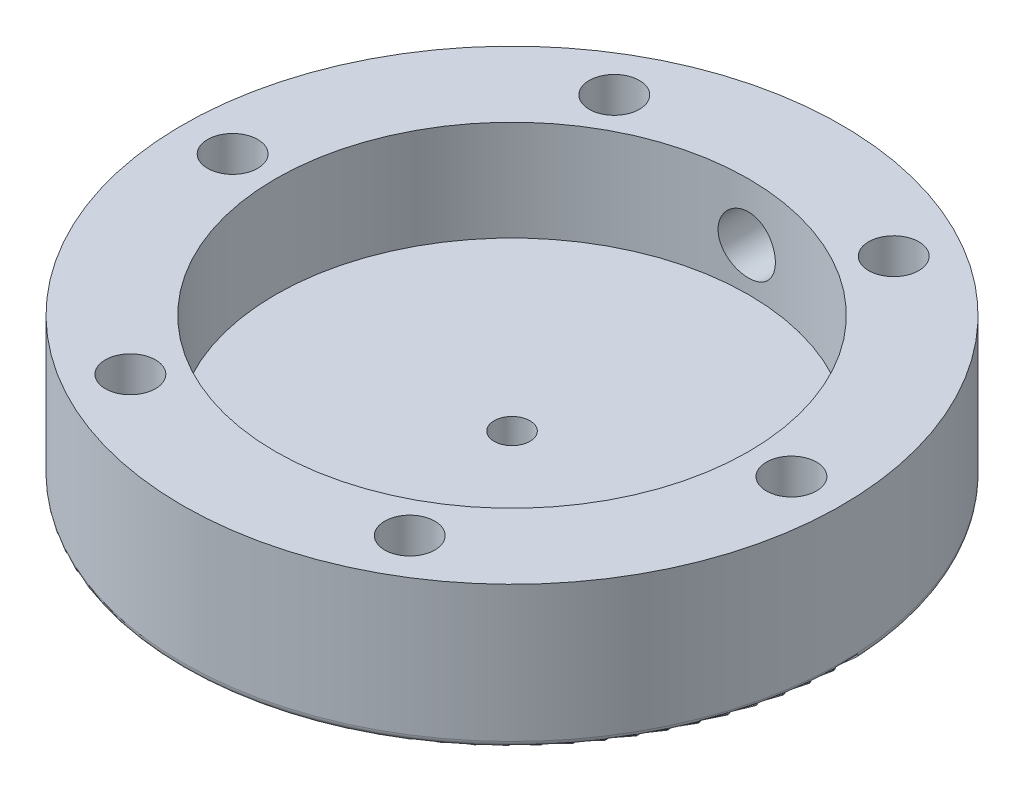
ISO-10303-21;
HEADER;
FILE_DESCRIPTION(('STEP AP214'),'2;1');
FILE_NAME('part.step','',(''),(''),'','','');
FILE_SCHEMA(('AUTOMOTIVE_DESIGN { 1 0 10303 214 1 1 1 1 }'));
ENDSEC;
DATA;
#1=APPLICATION_CONTEXT('core data for automotive mechanical design processes');
#2=APPLICATION_PROTOCOL_DEFINITION('international standard','automotive_design',2000,#1);
#3=PRODUCT_CONTEXT('',#1,'mechanical');
#4=PRODUCT('Part','Part','',(#3));
#5=PRODUCT_RELATED_PRODUCT_CATEGORY('part','',(#4));
#6=PRODUCT_DEFINITION_FORMATION('','',#4);
#7=PRODUCT_DEFINITION_CONTEXT('part definition',#1,'design');
#8=PRODUCT_DEFINITION('design','',#6,#7);
#9=PRODUCT_DEFINITION_SHAPE('','',#8);
#10=(LENGTH_UNIT() NAMED_UNIT(*) SI_UNIT(.MILLI.,.METRE.));
#11=(NAMED_UNIT(*) PLANE_ANGLE_UNIT() SI_UNIT($,.RADIAN.));
#12=(NAMED_UNIT(*) SI_UNIT($,.STERADIAN.) SOLID_ANGLE_UNIT());
#13=UNCERTAINTY_MEASURE_WITH_UNIT(LENGTH_MEASURE(1.E-05),#10,'distance_accuracy_value','');
#14=(GEOMETRIC_REPRESENTATION_CONTEXT(3) GLOBAL_UNCERTAINTY_ASSIGNED_CONTEXT((#13)) GLOBAL_UNIT_ASSIGNED_CONTEXT((#10,
#11,#12)) REPRESENTATION_CONTEXT('',''));
#15=CARTESIAN_POINT('',(0.,0.,0.));
#16=DIRECTION('',(0.,0.,1.));
#17=DIRECTION('',(1.,0.,0.));
#18=AXIS2_PLACEMENT_3D('',#15,#16,#17);
#19=CARTESIAN_POINT('',(0.,20.,0.));
#20=DIRECTION('',(0.,-1.,0.));
#21=DIRECTION('',(0.,0.,-1.));
#22=AXIS2_PLACEMENT_3D('',#19,#20,#21);
#23=CYLINDRICAL_SURFACE('',#22,2.5);
#24=CARTESIAN_POINT('',(0.,6.,0.));
#25=DIRECTION('',(0.,1.,0.));
#26=DIRECTION('',(0.,0.,1.));
#27=AXIS2_PLACEMENT_3D('',#24,#25,#26);
#28=CIRCLE('',#27,2.5);
#29=CARTESIAN_POINT('',(0.,6.,2.5));
#30=VERTEX_POINT('',#29);
#31=EDGE_CURVE('E65',#30,#30,#28,.T.);
#32=ORIENTED_EDGE('',*,*,#31,.T.);
#33=EDGE_LOOP('',(#32));
#34=FACE_BOUND('',#33,.T.);
#35=CARTESIAN_POINT('',(0.,0.,0.));
#36=DIRECTION('',(0.,-1.,0.));
#37=DIRECTION('',(0.,0.,-1.));
#38=AXIS2_PLACEMENT_3D('',#35,#36,#37);
#39=CIRCLE('',#38,2.5);
#40=CARTESIAN_POINT('',(0.,0.,-2.5));
#41=VERTEX_POINT('',#40);
#42=EDGE_CURVE('E54',#41,#41,#39,.F.);
#43=ORIENTED_EDGE('',*,*,#42,.F.);
#44=EDGE_LOOP('',(#43));
#45=FACE_BOUND('',#44,.T.);
#46=ADVANCED_FACE('F33',(#34,#45),#23,.F.);
#47=CARTESIAN_POINT('',(0.,20.,0.));
#48=DIRECTION('',(0.,-1.,0.));
#49=DIRECTION('',(0.,0.,-1.));
#50=AXIS2_PLACEMENT_3D('',#47,#48,#49);
#51=CYLINDRICAL_SURFACE('',#50,46.);
#52=CARTESIAN_POINT('',(0.,16.,-46.));
#53=CARTESIAN_POINT('',(-0.224227383894109,15.9999902223244,-45.9999977285705));
#54=CARTESIAN_POINT('',(-0.448606525183141,15.9810823481538,-45.9983430362557));
#55=CARTESIAN_POINT('',(-0.891154156323271,15.905934927026,-45.9919012379841));
#56=CARTESIAN_POINT('',(-1.10931535995352,15.8496533211501,-45.9871106030481));
#57=CARTESIAN_POINT('',(-1.53295378380859,15.7014005001201,-45.9749381658736));
#58=CARTESIAN_POINT('',(-1.73843820070689,15.6094497546826,-45.9675578500262));
#59=CARTESIAN_POINT('',(-2.13100809888229,15.3925060672846,-45.9510332255131));
#60=CARTESIAN_POINT('',(-2.31809744825638,15.2675200924152,-45.9418892889027));
#61=CARTESIAN_POINT('',(-2.66913129878992,14.9876817198155,-45.9228348976703));
#62=CARTESIAN_POINT('',(-2.83301797480505,14.832756902906,-45.9129226200477));
#63=CARTESIAN_POINT('',(-3.13249799915954,14.4975919754114,-45.8934639727461));
#64=CARTESIAN_POINT('',(-3.26809009164363,14.3173507417508,-45.883917619324));
#65=CARTESIAN_POINT('',(-3.50732983244712,13.9363164964854,-45.8662523263715));
#66=CARTESIAN_POINT('',(-3.61092631199781,13.7354912420483,-45.8581356821084));
#67=CARTESIAN_POINT('',(-3.78290727978104,13.3192141148022,-45.8442700926442));
#68=CARTESIAN_POINT('',(-3.85129243978993,13.1037625211294,-45.8385211022726));
#69=CARTESIAN_POINT('',(-3.95074097738121,12.6649304672214,-45.830057344427));
#70=CARTESIAN_POINT('',(-3.98189897039565,12.4415715996064,-45.8273348860433));
#71=CARTESIAN_POINT('',(-4.00630104440279,11.9927790924027,-45.8252082353394));
#72=CARTESIAN_POINT('',(-3.99954589438519,11.7673454949882,-45.8258039757165));
#73=CARTESIAN_POINT('',(-3.9483915880778,11.321451925075,-45.8302394140666));
#74=CARTESIAN_POINT('',(-3.90409535607296,11.1009800442069,-45.8340702424775));
#75=CARTESIAN_POINT('',(-3.77927624600677,10.6706122676921,-45.8445303189289));
#76=CARTESIAN_POINT('',(-3.69875298659972,10.460716483401,-45.8511595964273));
#77=CARTESIAN_POINT('',(-3.50365067255338,10.0571316495117,-45.866479827065));
#78=CARTESIAN_POINT('',(-3.38902554426596,9.86346498303699,-45.8751735661868));
#79=CARTESIAN_POINT('',(-3.12900647092458,9.49808067860247,-45.8936406284605));
#80=CARTESIAN_POINT('',(-2.98361184659911,9.3263635253373,-45.9034139754438));
#81=CARTESIAN_POINT('',(-2.66560421524801,9.00915428882337,-45.9229785147518));
#82=CARTESIAN_POINT('',(-2.4929022472207,8.86375137254269,-45.9327696582409));
#83=CARTESIAN_POINT('',(-2.12549237013378,8.60398782752038,-45.95123564835));
#84=CARTESIAN_POINT('',(-1.93078444459427,8.48962722202606,-45.959910494134));
#85=CARTESIAN_POINT('',(-1.52483096588586,8.29519972840698,-45.9751683502548));
#86=CARTESIAN_POINT('',(-1.31358345578605,8.21513690560241,-45.9817511125928));
#87=CARTESIAN_POINT('',(-0.880574461427622,8.09164068539059,-45.9920803344126));
#88=CARTESIAN_POINT('',(-0.658813214898611,8.04820646017873,-45.995826857993));
#89=CARTESIAN_POINT('',(-0.21184447915289,7.99931243567538,-46.0000532442106));
#90=CARTESIAN_POINT('',(0.0133494440173136,7.99372949782599,-46.0005436994455));
#91=CARTESIAN_POINT('',(0.461469996673726,8.02037377739986,-45.9982310016282));
#92=CARTESIAN_POINT('',(0.684396649193822,8.05260061031447,-45.9954278820702));
#93=CARTESIAN_POINT('',(1.12130261089924,8.15384754873136,-45.9868500316988));
#94=CARTESIAN_POINT('',(1.33529527230571,8.22281046045096,-45.9810799206281));
#95=CARTESIAN_POINT('',(1.74867267660003,8.39551346360269,-45.967216103292));
#96=CARTESIAN_POINT('',(1.9480571686755,8.49925415197528,-45.9591223571432));
#97=CARTESIAN_POINT('',(2.32711808841676,8.73887651706901,-45.9414917704405));
#98=CARTESIAN_POINT('',(2.50674286157891,8.87483963498195,-45.9319512956969));
#99=CARTESIAN_POINT('',(2.84066374135941,9.17492989696734,-45.9125109361372));
#100=CARTESIAN_POINT('',(2.99495936860324,9.33905757395658,-45.9026110445232));
#101=CARTESIAN_POINT('',(3.27426550151283,9.69135291706406,-45.8835361672919));
#102=CARTESIAN_POINT('',(3.39919555788599,9.87958449040562,-45.8743632176725));
#103=CARTESIAN_POINT('',(3.61567234236894,10.2744269056061,-45.8578101371487));
#104=CARTESIAN_POINT('',(3.70721942907557,10.4810375500091,-45.8504299869865));
#105=CARTESIAN_POINT('',(3.85419502490978,10.9064901436496,-45.8383098416306));
#106=CARTESIAN_POINT('',(3.90967250193944,11.1253150704724,-45.8335662683104));
#107=CARTESIAN_POINT('',(3.98309339935581,11.5692170335405,-45.8272445862578));
#108=CARTESIAN_POINT('',(4.00103761191455,11.7942939377307,-45.825666410717));
#109=CARTESIAN_POINT('',(3.99887309501891,12.2435112367157,-45.8258552825946));
#110=CARTESIAN_POINT('',(3.97889076180226,12.4676522560246,-45.8276112185648));
#111=CARTESIAN_POINT('',(3.90170423350695,12.9093817014037,-45.834246839158));
#112=CARTESIAN_POINT('',(3.84449998433456,13.1269701179508,-45.8391265283207));
#113=CARTESIAN_POINT('',(3.69452606310881,13.5494241459757,-45.8514568827458));
#114=CARTESIAN_POINT('',(3.6017589707124,13.7542906790211,-45.8589073615243));
#115=CARTESIAN_POINT('',(3.38330655214035,14.1455631184226,-45.8755401471554));
#116=CARTESIAN_POINT('',(3.25762167508082,14.3319692765964,-45.8847224303796));
#117=CARTESIAN_POINT('',(2.97642627183586,14.6816767736096,-45.9038206784499));
#118=CARTESIAN_POINT('',(2.82082198308656,14.8449025967924,-45.9137388879215));
#119=CARTESIAN_POINT('',(2.48437904881077,15.1429886856669,-45.93317092391));
#120=CARTESIAN_POINT('',(2.303534319391,15.2778420928329,-45.9426846522082));
#121=CARTESIAN_POINT('',(1.92136583977714,15.5155531499808,-45.9602544666636));
#122=CARTESIAN_POINT('',(1.72000201971635,15.6183465404037,-45.9683076119567));
#123=CARTESIAN_POINT('',(1.30293824908928,15.7885308261092,-45.9820150223571));
#124=CARTESIAN_POINT('',(1.08725503492918,15.8559622592335,-45.9876720328809));
#125=CARTESIAN_POINT('',(0.725257992711599,15.9364074005984,-45.994503746574));
#126=CARTESIAN_POINT('',(0.581269530602112,15.9602227509663,-45.9965554127388));
#127=CARTESIAN_POINT('',(0.291542097632153,15.9920222063787,-45.9993042759584));
#128=CARTESIAN_POINT('',(0.145803131912244,16.000006357902,-46.0000014769897));
#129=CARTESIAN_POINT('',(0.,16.,-46.));
#130=B_SPLINE_CURVE_WITH_KNOTS('',3,(#52,#53,#54,#55,#56,#57,#58,#59,#60,#61,#62,#63,#64,#65,
#66,#67,#68,#69,#70,#71,#72,#73,#74,#75,#76,#77,#78,#79,#80,#81,#82,#83,#84,#85,#86,#87,#88,#89,
#90,#91,#92,#93,#94,#95,#96,#97,#98,#99,#100,#101,#102,#103,#104,#105,#106,#107,#108,#109,#110,
#111,#112,#113,#114,#115,#116,#117,#118,#119,#120,#121,#122,#123,#124,#125,#126,#127,#128,#129),
.UNSPECIFIED.,.T.,.F.,(4,2,2,2,2,2,2,2,2,2,2,2,2,2,2,2,2,2,2,2,2,2,2,2,2,2,2,2,2,2,2,2,2,2,2,2,
2,2,4),(0.,0.672149795371173,1.34505728632151,2.01757918073403,2.68995935408334,
3.36398678235651,4.03804412098098,4.71317392514569,5.38829084842311,6.06168824011353,
6.73507197338011,7.40661547829384,8.07816605241074,8.75062808366532,9.42310496183092,
10.0978195498406,10.7725346431367,11.4473296883784,12.1221094828746,12.7946930125715,
13.4672697024505,14.1388023163357,14.8103464572807,15.4836063550193,16.1568789932759,
16.8319751599037,17.507064074496,18.1812345677475,18.855390831904,19.5273043074988,
20.1992187595716,20.8710844815444,21.5429410373477,22.2169384480893,22.8910985989687,
23.5666014469276,24.2413282173606,24.6783927333046,25.11545596607),.UNSPECIFIED.);
#131=CARTESIAN_POINT('',(0.,16.,-46.));
#132=VERTEX_POINT('',#131);
#133=EDGE_CURVE('E119',#132,#132,#130,.T.);
#134=ORIENTED_EDGE('',*,*,#133,.T.);
#135=EDGE_LOOP('',(#134));
#136=FACE_BOUND('',#135,.T.);
#137=CARTESIAN_POINT('',(0.,1.,0.));
#138=DIRECTION('',(0.,1.,0.));
#139=DIRECTION('',(0.,0.,1.));
#140=AXIS2_PLACEMENT_3D('',#137,#138,#139);
#141=CIRCLE('',#140,46.);
#142=CARTESIAN_POINT('',(0.,1.,46.));
#143=VERTEX_POINT('',#142);
#144=EDGE_CURVE('E61',#143,#143,#141,.T.);
#145=ORIENTED_EDGE('',*,*,#144,.T.);
#146=EDGE_LOOP('',(#145));
#147=FACE_BOUND('',#146,.T.);
#148=CARTESIAN_POINT('',(0.,20.,0.));
#149=DIRECTION('',(0.,1.,0.));
#150=DIRECTION('',(0.,0.,1.));
#151=AXIS2_PLACEMENT_3D('',#148,#149,#150);
#152=CIRCLE('',#151,46.);
#153=CARTESIAN_POINT('',(0.,20.,46.));
#154=VERTEX_POINT('',#153);
#155=EDGE_CURVE('E70',#154,#154,#152,.T.);
#156=ORIENTED_EDGE('',*,*,#155,.F.);
#157=EDGE_LOOP('',(#156));
#158=FACE_BOUND('',#157,.T.);
#159=ADVANCED_FACE('F125',(#136,#147,#158),#51,.T.);
#160=CARTESIAN_POINT('',(0.,20.,0.));
#161=DIRECTION('',(0.,1.,0.));
#162=DIRECTION('',(0.,0.,1.));
#163=AXIS2_PLACEMENT_3D('',#160,#161,#162);
#164=PLANE('',#163);
#165=CARTESIAN_POINT('',(-39.,20.,0.));
#166=DIRECTION('',(0.,-1.,0.));
#167=DIRECTION('',(0.,0.,-1.));
#168=AXIS2_PLACEMENT_3D('',#165,#166,#167);
#169=CIRCLE('',#168,3.5);
#170=CARTESIAN_POINT('',(-39.,20.,-3.5));
#171=VERTEX_POINT('',#170);
#172=EDGE_CURVE('E69',#171,#171,#169,.T.);
#173=ORIENTED_EDGE('',*,*,#172,.T.);
#174=EDGE_LOOP('',(#173));
#175=FACE_BOUND('',#174,.T.);
#176=CARTESIAN_POINT('',(-19.5000000000004,20.,-33.7749907475929));
#177=DIRECTION('',(0.,-1.,0.));
#178=DIRECTION('',(0.,0.,-1.));
#179=AXIS2_PLACEMENT_3D('',#176,#177,#178);
#180=CIRCLE('',#179,3.5);
#181=CARTESIAN_POINT('',(-19.5000000000004,20.,-37.2749907475929));
#182=VERTEX_POINT('',#181);
#183=EDGE_CURVE('E87',#182,#182,#180,.T.);
#184=ORIENTED_EDGE('',*,*,#183,.T.);
#185=EDGE_LOOP('',(#184));
#186=FACE_BOUND('',#185,.T.);
#187=CARTESIAN_POINT('',(19.4999999999997,20.,-33.7749907475933));
#188=DIRECTION('',(0.,-1.,0.));
#189=DIRECTION('',(0.,0.,-1.));
#190=AXIS2_PLACEMENT_3D('',#187,#188,#189);
#191=CIRCLE('',#190,3.5);
#192=CARTESIAN_POINT('',(19.4999999999997,20.,-37.2749907475933));
#193=VERTEX_POINT('',#192);
#194=EDGE_CURVE('E86',#193,#193,#191,.T.);
#195=ORIENTED_EDGE('',*,*,#194,.T.);
#196=EDGE_LOOP('',(#195));
#197=FACE_BOUND('',#196,.T.);
#198=CARTESIAN_POINT('',(39.,20.,-2.72335544429764E-13));
#199=DIRECTION('',(0.,-1.,0.));
#200=DIRECTION('',(0.,0.,-1.));
#201=AXIS2_PLACEMENT_3D('',#198,#199,#200);
#202=CIRCLE('',#201,3.5);
#203=CARTESIAN_POINT('',(39.,20.,-3.50000000000027));
#204=VERTEX_POINT('',#203);
#205=EDGE_CURVE('E93',#204,#204,#202,.T.);
#206=ORIENTED_EDGE('',*,*,#205,.T.);
#207=EDGE_LOOP('',(#206));
#208=FACE_BOUND('',#207,.T.);
#209=CARTESIAN_POINT('',(19.5000000000002,20.,33.774990747593));
#210=DIRECTION('',(0.,-1.,0.));
#211=DIRECTION('',(0.,0.,-1.));
#212=AXIS2_PLACEMENT_3D('',#209,#210,#211);
#213=CIRCLE('',#212,3.5);
#214=CARTESIAN_POINT('',(19.5000000000002,20.,30.274990747593));
#215=VERTEX_POINT('',#214);
#216=EDGE_CURVE('E99',#215,#215,#213,.T.);
#217=ORIENTED_EDGE('',*,*,#216,.T.);
#218=EDGE_LOOP('',(#217));
#219=FACE_BOUND('',#218,.T.);
#220=CARTESIAN_POINT('',(-19.4999999999999,20.,33.7749907475932));
#221=DIRECTION('',(0.,-1.,0.));
#222=DIRECTION('',(0.,0.,-1.));
#223=AXIS2_PLACEMENT_3D('',#220,#221,#222);
#224=CIRCLE('',#223,3.5);
#225=CARTESIAN_POINT('',(-19.4999999999999,20.,30.2749907475932));
#226=VERTEX_POINT('',#225);
#227=EDGE_CURVE('E105',#226,#226,#224,.T.);
#228=ORIENTED_EDGE('',*,*,#227,.T.);
#229=EDGE_LOOP('',(#228));
#230=FACE_BOUND('',#229,.T.);
#231=CARTESIAN_POINT('',(0.,20.,0.));
#232=DIRECTION('',(0.,1.,0.));
#233=DIRECTION('',(0.,0.,1.));
#234=AXIS2_PLACEMENT_3D('',#231,#232,#233);
#235=CIRCLE('',#234,33.);
#236=CARTESIAN_POINT('',(0.,20.,33.));
#237=VERTEX_POINT('',#236);
#238=EDGE_CURVE('E68',#237,#237,#235,.T.);
#239=ORIENTED_EDGE('',*,*,#238,.F.);
#240=EDGE_LOOP('',(#239));
#241=FACE_BOUND('',#240,.T.);
#242=ORIENTED_EDGE('',*,*,#155,.T.);
#243=EDGE_LOOP('',(#242));
#244=FACE_BOUND('',#243,.T.);
#245=ADVANCED_FACE('F186',(#175,#186,#197,#208,#219,#230,#241,#244),#164,.T.);
#246=CARTESIAN_POINT('',(0.,0.,0.));
#247=DIRECTION('',(0.,1.,0.));
#248=DIRECTION('',(0.,0.,1.));
#249=AXIS2_PLACEMENT_3D('',#246,#247,#248);
#250=PLANE('',#249);
#251=CARTESIAN_POINT('',(0.,0.,0.));
#252=DIRECTION('',(0.,1.,0.));
#253=DIRECTION('',(0.,0.,1.));
#254=AXIS2_PLACEMENT_3D('',#251,#252,#253);
#255=CIRCLE('',#254,45.);
#256=CARTESIAN_POINT('',(0.,0.,45.));
#257=VERTEX_POINT('',#256);
#258=EDGE_CURVE('E51',#257,#257,#255,.F.);
#259=ORIENTED_EDGE('',*,*,#258,.T.);
#260=EDGE_LOOP('',(#259));
#261=FACE_BOUND('',#260,.T.);
#262=CARTESIAN_POINT('',(-39.,0.,0.));
#263=DIRECTION('',(0.,-1.,0.));
#264=DIRECTION('',(0.,0.,-1.));
#265=AXIS2_PLACEMENT_3D('',#262,#263,#264);
#266=CIRCLE('',#265,3.5);
#267=CARTESIAN_POINT('',(-39.,0.,-3.5));
#268=VERTEX_POINT('',#267);
#269=EDGE_CURVE('E108',#268,#268,#266,.T.);
#270=ORIENTED_EDGE('',*,*,#269,.F.);
#271=EDGE_LOOP('',(#270));
#272=FACE_BOUND('',#271,.T.);
#273=CARTESIAN_POINT('',(-19.5000000000004,0.,-33.7749907475929));
#274=DIRECTION('',(0.,-1.,0.));
#275=DIRECTION('',(0.,0.,-1.));
#276=AXIS2_PLACEMENT_3D('',#273,#274,#275);
#277=CIRCLE('',#276,3.5);
#278=CARTESIAN_POINT('',(-19.5000000000004,0.,-37.2749907475929));
#279=VERTEX_POINT('',#278);
#280=EDGE_CURVE('E57',#279,#279,#277,.T.);
#281=ORIENTED_EDGE('',*,*,#280,.F.);
#282=EDGE_LOOP('',(#281));
#283=FACE_BOUND('',#282,.T.);
#284=CARTESIAN_POINT('',(19.4999999999997,0.,-33.7749907475933));
#285=DIRECTION('',(0.,-1.,0.));
#286=DIRECTION('',(0.,0.,-1.));
#287=AXIS2_PLACEMENT_3D('',#284,#285,#286);
#288=CIRCLE('',#287,3.5);
#289=CARTESIAN_POINT('',(19.4999999999997,0.,-37.2749907475933));
#290=VERTEX_POINT('',#289);
#291=EDGE_CURVE('E83',#290,#290,#288,.T.);
#292=ORIENTED_EDGE('',*,*,#291,.F.);
#293=EDGE_LOOP('',(#292));
#294=FACE_BOUND('',#293,.T.);
#295=CARTESIAN_POINT('',(39.,0.,-2.72335544429764E-13));
#296=DIRECTION('',(0.,-1.,0.));
#297=DIRECTION('',(0.,0.,-1.));
#298=AXIS2_PLACEMENT_3D('',#295,#296,#297);
#299=CIRCLE('',#298,3.5);
#300=CARTESIAN_POINT('',(39.,0.,-3.50000000000027));
#301=VERTEX_POINT('',#300);
#302=EDGE_CURVE('E90',#301,#301,#299,.T.);
#303=ORIENTED_EDGE('',*,*,#302,.F.);
#304=EDGE_LOOP('',(#303));
#305=FACE_BOUND('',#304,.T.);
#306=CARTESIAN_POINT('',(19.5000000000002,0.,33.774990747593));
#307=DIRECTION('',(0.,-1.,0.));
#308=DIRECTION('',(0.,0.,-1.));
#309=AXIS2_PLACEMENT_3D('',#306,#307,#308);
#310=CIRCLE('',#309,3.5);
#311=CARTESIAN_POINT('',(19.5000000000002,0.,30.274990747593));
#312=VERTEX_POINT('',#311);
#313=EDGE_CURVE('E96',#312,#312,#310,.T.);
#314=ORIENTED_EDGE('',*,*,#313,.F.);
#315=EDGE_LOOP('',(#314));
#316=FACE_BOUND('',#315,.T.);
#317=CARTESIAN_POINT('',(-19.4999999999999,0.,33.7749907475932));
#318=DIRECTION('',(0.,-1.,0.));
#319=DIRECTION('',(0.,0.,-1.));
#320=AXIS2_PLACEMENT_3D('',#317,#318,#319);
#321=CIRCLE('',#320,3.5);
#322=CARTESIAN_POINT('',(-19.4999999999999,0.,30.2749907475932));
#323=VERTEX_POINT('',#322);
#324=EDGE_CURVE('E102',#323,#323,#321,.T.);
#325=ORIENTED_EDGE('',*,*,#324,.F.);
#326=EDGE_LOOP('',(#325));
#327=FACE_BOUND('',#326,.T.);
#328=CARTESIAN_POINT('',(0.,0.,0.));
#329=DIRECTION('',(0.,-1.,0.));
#330=DIRECTION('',(0.,0.,-1.));
#331=AXIS2_PLACEMENT_3D('',#328,#329,#330);
#332=CIRCLE('',#331,12.);
#333=CARTESIAN_POINT('',(0.,0.,-12.));
#334=VERTEX_POINT('',#333);
#335=EDGE_CURVE('E64',#334,#334,#332,.T.);
#336=ORIENTED_EDGE('',*,*,#335,.F.);
#337=EDGE_LOOP('',(#336));
#338=FACE_BOUND('',#337,.T.);
#339=ADVANCED_FACE('F184',(#261,#272,#283,#294,#305,#316,#327,#338),#250,.F.);
#340=CARTESIAN_POINT('',(0.,-10.,0.));
#341=DIRECTION('',(0.,1.,0.));
#342=DIRECTION('',(0.,0.,1.));
#343=AXIS2_PLACEMENT_3D('',#340,#341,#342);
#344=CYLINDRICAL_SURFACE('',#343,12.);
#345=CARTESIAN_POINT('',(0.,-10.,0.));
#346=DIRECTION('',(0.,-1.,0.));
#347=DIRECTION('',(0.,0.,-1.));
#348=AXIS2_PLACEMENT_3D('',#345,#346,#347);
#349=CIRCLE('',#348,12.);
#350=CARTESIAN_POINT('',(0.,-10.,-12.));
#351=VERTEX_POINT('',#350);
#352=EDGE_CURVE('E73',#351,#351,#349,.T.);
#353=ORIENTED_EDGE('',*,*,#352,.F.);
#354=EDGE_LOOP('',(#353));
#355=FACE_BOUND('',#354,.T.);
#356=ORIENTED_EDGE('',*,*,#335,.T.);
#357=EDGE_LOOP('',(#356));
#358=FACE_BOUND('',#357,.T.);
#359=ADVANCED_FACE('F181',(#355,#358),#344,.T.);
#360=CARTESIAN_POINT('',(0.,-10.,0.));
#361=DIRECTION('',(0.,-1.,0.));
#362=DIRECTION('',(0.,0.,-1.));
#363=AXIS2_PLACEMENT_3D('',#360,#361,#362);
#364=PLANE('',#363);
#365=CARTESIAN_POINT('',(0.,-10.,0.));
#366=DIRECTION('',(0.,-1.,0.));
#367=DIRECTION('',(0.,0.,-1.));
#368=AXIS2_PLACEMENT_3D('',#365,#366,#367);
#369=CIRCLE('',#368,7.99999999999999);
#370=CARTESIAN_POINT('',(0.,-10.,-7.99999999999999));
#371=VERTEX_POINT('',#370);
#372=EDGE_CURVE('E10',#371,#371,#369,.F.);
#373=ORIENTED_EDGE('',*,*,#372,.T.);
#374=EDGE_LOOP('',(#373));
#375=FACE_BOUND('',#374,.T.);
#376=ORIENTED_EDGE('',*,*,#352,.T.);
#377=EDGE_LOOP('',(#376));
#378=FACE_BOUND('',#377,.T.);
#379=ADVANCED_FACE('F177',(#375,#378),#364,.T.);
#380=CARTESIAN_POINT('',(0.,6.,0.));
#381=DIRECTION('',(0.,1.,0.));
#382=DIRECTION('',(0.,0.,1.));
#383=AXIS2_PLACEMENT_3D('',#380,#381,#382);
#384=CYLINDRICAL_SURFACE('',#383,33.);
#385=CARTESIAN_POINT('',(4.,12.,-32.7566787083184));
#386=CARTESIAN_POINT('',(3.99999045298508,11.7762055034807,-32.7566818366577));
#387=CARTESIAN_POINT('',(3.98115515343243,11.5522697896419,-32.7589969177124));
#388=CARTESIAN_POINT('',(3.90631302023377,11.110626634477,-32.7680039727008));
#389=CARTESIAN_POINT('',(3.85026699225597,10.8929260131031,-32.7747005616006));
#390=CARTESIAN_POINT('',(3.70267655289125,10.4702114858093,-32.7917012296198));
#391=CARTESIAN_POINT('',(3.61115580778966,10.2651892272727,-32.8020029032309));
#392=CARTESIAN_POINT('',(3.39526371924446,9.87345279800498,-32.8250500965597));
#393=CARTESIAN_POINT('',(3.27089814151645,9.68673542184091,-32.8377951872424));
#394=CARTESIAN_POINT('',(2.99214417405283,9.33588554601347,-32.864368406131));
#395=CARTESIAN_POINT('',(2.83761726919589,9.17186345073592,-32.8782013482531));
#396=CARTESIAN_POINT('',(2.50322501027308,8.87201333478101,-32.905348295857));
#397=CARTESIAN_POINT('',(2.32335841356232,8.73618669760225,-32.9186622758482));
#398=CARTESIAN_POINT('',(1.94270104483964,8.49618911358668,-32.9433202079721));
#399=CARTESIAN_POINT('',(1.74184703190994,8.39211777612165,-32.9546579142429));
#400=CARTESIAN_POINT('',(1.325352481192,8.21922286326735,-32.9740330113373));
#401=CARTESIAN_POINT('',(1.10971246115218,8.15039805439581,-32.9820705176523));
#402=CARTESIAN_POINT('',(0.670894532630863,8.05027889992132,-32.993905717215));
#403=CARTESIAN_POINT('',(0.447759006205902,8.0188012813973,-32.9977241084167));
#404=CARTESIAN_POINT('',(-0.00065790244033778,7.99370220196666,-33.0007614848467));
#405=CARTESIAN_POINT('',(-0.22593920469066,8.00007933571949,-32.9999806408196));
#406=CARTESIAN_POINT('',(-0.671006287963217,8.05036154861505,-32.9939243045577));
#407=CARTESIAN_POINT('',(-0.890814702972183,8.09406952855121,-32.9886724189773));
#408=CARTESIAN_POINT('',(-1.31995337515371,8.2174647919492,-32.974290708158));
#409=CARTESIAN_POINT('',(-1.52928344316775,8.2971527246728,-32.9651608129403));
#410=CARTESIAN_POINT('',(-1.93213533023985,8.49045652019151,-32.9440083562255));
#411=CARTESIAN_POINT('',(-2.12561567058178,8.60415799663609,-32.931978510434));
#412=CARTESIAN_POINT('',(-2.49082341217299,8.86219905355329,-32.9063727008439));
#413=CARTESIAN_POINT('',(-2.66254987465172,9.00653995552618,-32.8927966703688));
#414=CARTESIAN_POINT('',(-2.98053255244169,9.32286724018325,-32.8655155228159));
#415=CARTESIAN_POINT('',(-3.12661796887099,9.49502534583268,-32.8518101368879));
#416=CARTESIAN_POINT('',(-3.38784512845958,9.86150929373647,-32.8259012315593));
#417=CARTESIAN_POINT('',(-3.50298678476122,10.0558351982126,-32.8136977163744));
#418=CARTESIAN_POINT('',(-3.69906598308285,10.4612872652783,-32.7921742461928));
#419=CARTESIAN_POINT('',(-3.77999036212115,10.6724198561563,-32.7828554012633));
#420=CARTESIAN_POINT('',(-3.90518910413138,11.1054153047808,-32.7681782798095));
#421=CARTESIAN_POINT('',(-3.94946512451534,11.3272776767954,-32.762819824179));
#422=CARTESIAN_POINT('',(-3.99988519584663,11.7739278468144,-32.7567026814491));
#423=CARTESIAN_POINT('',(-4.00626937814872,11.9986881561439,-32.7559150285832));
#424=CARTESIAN_POINT('',(-3.98135765376567,12.4460751506793,-32.7589520971464));
#425=CARTESIAN_POINT('',(-3.95006250113017,12.6687018784931,-32.7627767262732));
#426=CARTESIAN_POINT('',(-3.85088243715065,13.1047858001424,-32.7745810041736));
#427=CARTESIAN_POINT('',(-3.78311334910617,13.3182697228316,-32.7825474977128));
#428=CARTESIAN_POINT('',(-3.6130281927127,13.7308433110953,-32.8017272208065));
#429=CARTESIAN_POINT('',(-3.51071097938724,13.9299324993412,-32.8129405579643));
#430=CARTESIAN_POINT('',(-3.27384173326402,14.3091529822973,-32.8374200222184));
#431=CARTESIAN_POINT('',(-3.13913195401655,14.4891850938432,-32.8506960788503));
#432=CARTESIAN_POINT('',(-2.84152499642419,14.8241700082929,-32.8777737228222));
#433=CARTESIAN_POINT('',(-2.67862678829609,14.9791218945623,-32.8915753293471));
#434=CARTESIAN_POINT('',(-2.32821925622029,15.2603888302814,-32.9182377149735));
#435=CARTESIAN_POINT('',(-2.14058295469221,15.3865462764056,-32.931093067008));
#436=CARTESIAN_POINT('',(-1.74664463837716,15.6055536685178,-32.9543337105298));
#437=CARTESIAN_POINT('',(-1.54034298058246,15.698404251362,-32.9647190492445));
#438=CARTESIAN_POINT('',(-1.11545816602638,15.8479008451535,-32.9818253693875));
#439=CARTESIAN_POINT('',(-0.896907684380684,15.9046386163826,-32.98855563168));
#440=CARTESIAN_POINT('',(-0.453295431839337,15.9805976860595,-32.9976319498885));
#441=CARTESIAN_POINT('',(-0.228233936570892,15.9998205702532,-32.9999781911159));
#442=CARTESIAN_POINT('',(0.220471313794806,16.0001757912835,-33.000021367475));
#443=CARTESIAN_POINT('',(0.444114912587442,15.9815514127923,-32.9977479977708));
#444=CARTESIAN_POINT('',(0.885069092955427,15.9072552066791,-32.9888663257534));
#445=CARTESIAN_POINT('',(1.10237967714821,15.851583394369,-32.9822580252319));
#446=CARTESIAN_POINT('',(1.5244721638081,15.7048476023688,-32.9654458725196));
#447=CARTESIAN_POINT('',(1.72925791053233,15.6137945460056,-32.9552431301393));
#448=CARTESIAN_POINT('',(2.12068092912073,15.39890614139,-32.9323730883384));
#449=CARTESIAN_POINT('',(2.30731803758764,15.2750704980243,-32.9197057667317));
#450=CARTESIAN_POINT('',(2.65838965314681,14.9972296410101,-32.8932241859913));
#451=CARTESIAN_POINT('',(2.82268032326465,14.8430432971494,-32.8794033429218));
#452=CARTESIAN_POINT('',(3.12315293120787,14.5092521832838,-32.8522257784064));
#453=CARTESIAN_POINT('',(3.25932818941034,14.3296413900166,-32.8388691678779));
#454=CARTESIAN_POINT('',(3.50012370208704,13.9493550949333,-32.8140805805222));
#455=CARTESIAN_POINT('',(3.60462743792878,13.7486053858914,-32.8026557772711));
#456=CARTESIAN_POINT('',(3.77829295203558,13.3323825554191,-32.7831085801835));
#457=CARTESIAN_POINT('',(3.84749340586574,13.1169258406297,-32.7749825744407));
#458=CARTESIAN_POINT('',(3.93190579331955,12.7502798683407,-32.7649388059801));
#459=CARTESIAN_POINT('',(3.9574047064634,12.6014089164404,-32.7618565652437));
#460=CARTESIAN_POINT('',(3.99145496920686,12.3017133657061,-32.7577254688871));
#461=CARTESIAN_POINT('',(4.00000643687607,12.15088878049,-32.7566765991008));
#462=CARTESIAN_POINT('',(4.,12.,-32.7566787083184));
#463=B_SPLINE_CURVE_WITH_KNOTS('',3,(#385,#386,#387,#388,#389,#390,#391,#392,#393,#394,#395,
#396,#397,#398,#399,#400,#401,#402,#403,#404,#405,#406,#407,#408,#409,#410,#411,#412,#413,#414,
#415,#416,#417,#418,#419,#420,#421,#422,#423,#424,#425,#426,#427,#428,#429,#430,#431,#432,#433,
#434,#435,#436,#437,#438,#439,#440,#441,#442,#443,#444,#445,#446,#447,#448,#449,#450,#451,#452,
#453,#454,#455,#456,#457,#458,#459,#460,#461,#462),.UNSPECIFIED.,.T.,.F.,(4,2,2,2,2,2,2,2,2,2,2,
2,2,2,2,2,2,2,2,2,2,2,2,2,2,2,2,2,2,2,2,2,2,2,2,2,2,2,4),(0.,0.67083230252087,1.34237232097104,
2.01346510316178,2.68444015720846,3.35857240178021,4.03273771695039,4.70899650098514,
5.38523161715035,6.05813435270304,6.73101210720266,7.40035901245525,8.06971799662072,
8.74077617066324,9.41186329380664,10.087263693043,10.762665988076,11.4383278665181,
12.1139591866663,12.7853042281999,13.4566358348076,14.1258480927268,14.7950825315168,
15.467644495884,16.140231035558,16.8164150504307,17.4925861353889,18.1670321819991,
18.8414497193086,19.5115457711023,20.1816415459413,20.8515306048434,21.5214256943855,
22.1954469793233,22.8696282135606,23.5462604462507,24.2221498121776,24.6744476783457,
25.1267423934303),.UNSPECIFIED.);
#464=CARTESIAN_POINT('',(4.,12.,-32.7566787083184));
#465=VERTEX_POINT('',#464);
#466=EDGE_CURVE('E38',#465,#465,#463,.T.);
#467=ORIENTED_EDGE('',*,*,#466,.T.);
#468=EDGE_LOOP('',(#467));
#469=FACE_BOUND('',#468,.T.);
#470=CARTESIAN_POINT('',(0.,6.,0.));
#471=DIRECTION('',(0.,1.,0.));
#472=DIRECTION('',(0.,0.,1.));
#473=AXIS2_PLACEMENT_3D('',#470,#471,#472);
#474=CIRCLE('',#473,33.);
#475=CARTESIAN_POINT('',(0.,6.,33.));
#476=VERTEX_POINT('',#475);
#477=EDGE_CURVE('E78',#476,#476,#474,.T.);
#478=ORIENTED_EDGE('',*,*,#477,.F.);
#479=EDGE_LOOP('',(#478));
#480=FACE_BOUND('',#479,.T.);
#481=ORIENTED_EDGE('',*,*,#238,.T.);
#482=EDGE_LOOP('',(#481));
#483=FACE_BOUND('',#482,.T.);
#484=ADVANCED_FACE('F172',(#469,#480,#483),#384,.F.);
#485=CARTESIAN_POINT('',(0.,6.,0.));
#486=DIRECTION('',(0.,1.,0.));
#487=DIRECTION('',(0.,0.,1.));
#488=AXIS2_PLACEMENT_3D('',#485,#486,#487);
#489=PLANE('',#488);
#490=ORIENTED_EDGE('',*,*,#31,.F.);
#491=EDGE_LOOP('',(#490));
#492=FACE_BOUND('',#491,.T.);
#493=ORIENTED_EDGE('',*,*,#477,.T.);
#494=EDGE_LOOP('',(#493));
#495=FACE_BOUND('',#494,.T.);
#496=ADVANCED_FACE('F156',(#492,#495),#489,.T.);
#497=CARTESIAN_POINT('',(-19.4999999999999,20.,33.7749907475932));
#498=DIRECTION('',(0.,-1.,0.));
#499=DIRECTION('',(0.,0.,-1.));
#500=AXIS2_PLACEMENT_3D('',#497,#498,#499);
#501=CYLINDRICAL_SURFACE('',#500,3.5);
#502=ORIENTED_EDGE('',*,*,#227,.F.);
#503=EDGE_LOOP('',(#502));
#504=FACE_BOUND('',#503,.T.);
#505=ORIENTED_EDGE('',*,*,#324,.T.);
#506=EDGE_LOOP('',(#505));
#507=FACE_BOUND('',#506,.T.);
#508=ADVANCED_FACE('F152',(#504,#507),#501,.F.);
#509=CARTESIAN_POINT('',(19.5000000000002,20.,33.774990747593));
#510=DIRECTION('',(0.,-1.,0.));
#511=DIRECTION('',(0.,0.,-1.));
#512=AXIS2_PLACEMENT_3D('',#509,#510,#511);
#513=CYLINDRICAL_SURFACE('',#512,3.5);
#514=ORIENTED_EDGE('',*,*,#216,.F.);
#515=EDGE_LOOP('',(#514));
#516=FACE_BOUND('',#515,.T.);
#517=ORIENTED_EDGE('',*,*,#313,.T.);
#518=EDGE_LOOP('',(#517));
#519=FACE_BOUND('',#518,.T.);
#520=ADVANCED_FACE('F155',(#516,#519),#513,.F.);
#521=CARTESIAN_POINT('',(39.,20.,-2.72335544429764E-13));
#522=DIRECTION('',(0.,-1.,0.));
#523=DIRECTION('',(0.,0.,-1.));
#524=AXIS2_PLACEMENT_3D('',#521,#522,#523);
#525=CYLINDRICAL_SURFACE('',#524,3.5);
#526=ORIENTED_EDGE('',*,*,#205,.F.);
#527=EDGE_LOOP('',(#526));
#528=FACE_BOUND('',#527,.T.);
#529=ORIENTED_EDGE('',*,*,#302,.T.);
#530=EDGE_LOOP('',(#529));
#531=FACE_BOUND('',#530,.T.);
#532=ADVANCED_FACE('F160',(#528,#531),#525,.F.);
#533=CARTESIAN_POINT('',(19.4999999999997,20.,-33.7749907475933));
#534=DIRECTION('',(0.,-1.,0.));
#535=DIRECTION('',(0.,0.,-1.));
#536=AXIS2_PLACEMENT_3D('',#533,#534,#535);
#537=CYLINDRICAL_SURFACE('',#536,3.5);
#538=ORIENTED_EDGE('',*,*,#194,.F.);
#539=EDGE_LOOP('',(#538));
#540=FACE_BOUND('',#539,.T.);
#541=ORIENTED_EDGE('',*,*,#291,.T.);
#542=EDGE_LOOP('',(#541));
#543=FACE_BOUND('',#542,.T.);
#544=ADVANCED_FACE('F150',(#540,#543),#537,.F.);
#545=CARTESIAN_POINT('',(-19.5000000000004,20.,-33.7749907475929));
#546=DIRECTION('',(0.,-1.,0.));
#547=DIRECTION('',(0.,0.,-1.));
#548=AXIS2_PLACEMENT_3D('',#545,#546,#547);
#549=CYLINDRICAL_SURFACE('',#548,3.5);
#550=ORIENTED_EDGE('',*,*,#183,.F.);
#551=EDGE_LOOP('',(#550));
#552=FACE_BOUND('',#551,.T.);
#553=ORIENTED_EDGE('',*,*,#280,.T.);
#554=EDGE_LOOP('',(#553));
#555=FACE_BOUND('',#554,.T.);
#556=ADVANCED_FACE('F146',(#552,#555),#549,.F.);
#557=CARTESIAN_POINT('',(-39.,20.,0.));
#558=DIRECTION('',(0.,-1.,0.));
#559=DIRECTION('',(0.,0.,-1.));
#560=AXIS2_PLACEMENT_3D('',#557,#558,#559);
#561=CYLINDRICAL_SURFACE('',#560,3.5);
#562=ORIENTED_EDGE('',*,*,#172,.F.);
#563=EDGE_LOOP('',(#562));
#564=FACE_BOUND('',#563,.T.);
#565=ORIENTED_EDGE('',*,*,#269,.T.);
#566=EDGE_LOOP('',(#565));
#567=FACE_BOUND('',#566,.T.);
#568=ADVANCED_FACE('F143',(#564,#567),#561,.F.);
#569=CARTESIAN_POINT('',(0.,1.,0.));
#570=DIRECTION('',(0.,1.,0.));
#571=DIRECTION('',(0.,0.,1.));
#572=AXIS2_PLACEMENT_3D('',#569,#570,#571);
#573=TOROIDAL_SURFACE('',#572,45.,1.);
#574=ORIENTED_EDGE('',*,*,#258,.F.);
#575=EDGE_LOOP('',(#574));
#576=FACE_BOUND('',#575,.T.);
#577=ORIENTED_EDGE('',*,*,#144,.F.);
#578=EDGE_LOOP('',(#577));
#579=FACE_BOUND('',#578,.T.);
#580=ADVANCED_FACE('F138',(#576,#579),#573,.T.);
#581=CARTESIAN_POINT('',(0.,0.,0.));
#582=DIRECTION('',(0.,-1.,0.));
#583=DIRECTION('',(0.,0.,-1.));
#584=AXIS2_PLACEMENT_3D('',#581,#582,#583);
#585=PLANE('',#584);
#586=CARTESIAN_POINT('',(0.,0.,0.));
#587=DIRECTION('',(0.,-1.,0.));
#588=DIRECTION('',(0.,0.,-1.));
#589=AXIS2_PLACEMENT_3D('',#586,#587,#588);
#590=CIRCLE('',#589,7.);
#591=CARTESIAN_POINT('',(0.,0.,-7.));
#592=VERTEX_POINT('',#591);
#593=EDGE_CURVE('E58',#592,#592,#590,.T.);
#594=ORIENTED_EDGE('',*,*,#593,.T.);
#595=EDGE_LOOP('',(#594));
#596=FACE_BOUND('',#595,.T.);
#597=ORIENTED_EDGE('',*,*,#42,.T.);
#598=EDGE_LOOP('',(#597));
#599=FACE_BOUND('',#598,.T.);
#600=ADVANCED_FACE('F133',(#596,#599),#585,.T.);
#601=CARTESIAN_POINT('',(0.,0.,0.));
#602=DIRECTION('',(0.,-1.,0.));
#603=DIRECTION('',(0.,0.,-1.));
#604=AXIS2_PLACEMENT_3D('',#601,#602,#603);
#605=CYLINDRICAL_SURFACE('',#604,7.);
#606=CARTESIAN_POINT('',(0.,-9.00000000000002,0.));
#607=DIRECTION('',(0.,-1.,0.));
#608=DIRECTION('',(0.,0.,-1.));
#609=AXIS2_PLACEMENT_3D('',#606,#607,#608);
#610=CIRCLE('',#609,7.);
#611=CARTESIAN_POINT('',(0.,-9.00000000000002,-7.));
#612=VERTEX_POINT('',#611);
#613=EDGE_CURVE('E47',#612,#612,#610,.T.);
#614=ORIENTED_EDGE('',*,*,#613,.T.);
#615=EDGE_LOOP('',(#614));
#616=FACE_BOUND('',#615,.T.);
#617=ORIENTED_EDGE('',*,*,#593,.F.);
#618=EDGE_LOOP('',(#617));
#619=FACE_BOUND('',#618,.T.);
#620=ADVANCED_FACE('F137',(#616,#619),#605,.F.);
#621=CARTESIAN_POINT('',(0.,-9.00000000000002,0.));
#622=DIRECTION('',(0.,-1.,0.));
#623=DIRECTION('',(0.,0.,-1.));
#624=AXIS2_PLACEMENT_3D('',#621,#622,#623);
#625=CONICAL_SURFACE('',#624,7.,0.785398163397457);
#626=ORIENTED_EDGE('',*,*,#372,.F.);
#627=EDGE_LOOP('',(#626));
#628=FACE_BOUND('',#627,.T.);
#629=ORIENTED_EDGE('',*,*,#613,.F.);
#630=EDGE_LOOP('',(#629));
#631=FACE_BOUND('',#630,.T.);
#632=ADVANCED_FACE('F36',(#628,#631),#625,.F.);
#633=CARTESIAN_POINT('',(0.,12.,-250.));
#634=DIRECTION('',(0.,0.,1.));
#635=DIRECTION('',(1.,0.,0.));
#636=AXIS2_PLACEMENT_3D('',#633,#634,#635);
#637=CYLINDRICAL_SURFACE('',#636,4.);
#638=ORIENTED_EDGE('',*,*,#466,.F.);
#639=EDGE_LOOP('',(#638));
#640=FACE_BOUND('',#639,.T.);
#641=ORIENTED_EDGE('',*,*,#133,.F.);
#642=EDGE_LOOP('',(#641));
#643=FACE_BOUND('',#642,.T.);
#644=ADVANCED_FACE('F128',(#640,#643),#637,.F.);
#645=CLOSED_SHELL('',(#46,#159,#245,#339,#359,#379,#484,#496,#508,#520,#532,#544,#556,#568,#580,
#600,#620,#632,#644));
#646=MANIFOLD_SOLID_BREP('B2',#645);
#647=ADVANCED_BREP_SHAPE_REPRESENTATION('',(#18,#646),#14);
#648=SHAPE_DEFINITION_REPRESENTATION(#9,#647);
ENDSEC;
END-ISO-10303-21;
